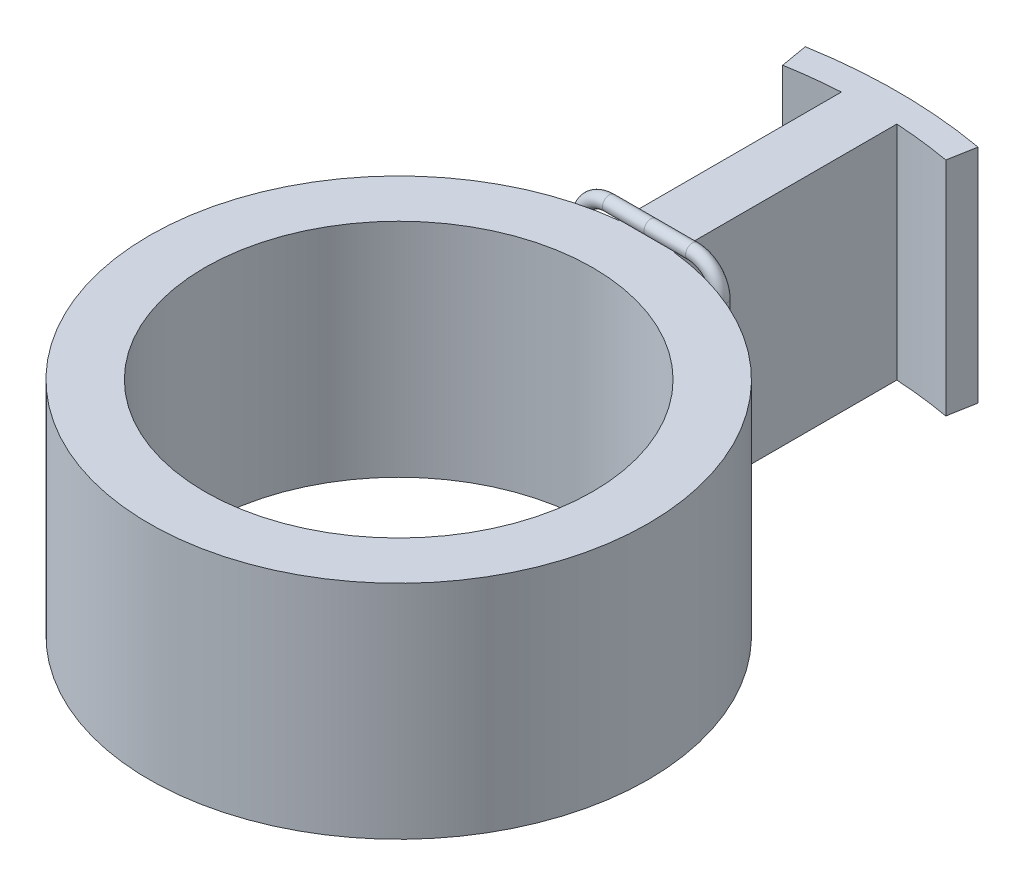
ISO-10303-21;
HEADER;
FILE_DESCRIPTION(('STEP AP214'),'2;1');
FILE_NAME('part.step','',(''),(''),'','','');
FILE_SCHEMA(('AUTOMOTIVE_DESIGN { 1 0 10303 214 1 1 1 1 }'));
ENDSEC;
DATA;
#1=APPLICATION_CONTEXT('core data for automotive mechanical design processes');
#2=APPLICATION_PROTOCOL_DEFINITION('international standard','automotive_design',2000,#1);
#3=PRODUCT_CONTEXT('',#1,'mechanical');
#4=PRODUCT('Part','Part','',(#3));
#5=PRODUCT_RELATED_PRODUCT_CATEGORY('part','',(#4));
#6=PRODUCT_DEFINITION_FORMATION('','',#4);
#7=PRODUCT_DEFINITION_CONTEXT('part definition',#1,'design');
#8=PRODUCT_DEFINITION('design','',#6,#7);
#9=PRODUCT_DEFINITION_SHAPE('','',#8);
#10=(LENGTH_UNIT() NAMED_UNIT(*) SI_UNIT(.MILLI.,.METRE.));
#11=(NAMED_UNIT(*) PLANE_ANGLE_UNIT() SI_UNIT($,.RADIAN.));
#12=(NAMED_UNIT(*) SI_UNIT($,.STERADIAN.) SOLID_ANGLE_UNIT());
#13=UNCERTAINTY_MEASURE_WITH_UNIT(LENGTH_MEASURE(1.E-05),#10,'distance_accuracy_value','');
#14=(GEOMETRIC_REPRESENTATION_CONTEXT(3) GLOBAL_UNCERTAINTY_ASSIGNED_CONTEXT((#13)) GLOBAL_UNIT_ASSIGNED_CONTEXT((#10,
#11,#12)) REPRESENTATION_CONTEXT('',''));
#15=CARTESIAN_POINT('',(0.,0.,0.));
#16=DIRECTION('',(0.,0.,1.));
#17=DIRECTION('',(1.,0.,0.));
#18=AXIS2_PLACEMENT_3D('',#15,#16,#17);
#19=CARTESIAN_POINT('',(0.,80.,0.));
#20=DIRECTION('',(0.,1.,0.));
#21=DIRECTION('',(0.,0.,1.));
#22=AXIS2_PLACEMENT_3D('',#19,#20,#21);
#23=PLANE('',#22);
#24=DIRECTION('',(1.,0.,0.));
#25=VECTOR('',#24,1.);
#26=CARTESIAN_POINT('',(-14.9999999999999,80.,-89.9102752641149));
#27=LINE('',#26,#25);
#28=CARTESIAN_POINT('',(-9.99999999999999,80.,-89.9102752641149));
#29=VERTEX_POINT('',#28);
#30=CARTESIAN_POINT('',(0.,80.,-89.9102752641149));
#31=VERTEX_POINT('',#30);
#32=EDGE_CURVE('E242',#29,#31,#27,.T.);
#33=ORIENTED_EDGE('',*,*,#32,.F.);
#34=DIRECTION('',(0.,0.,1.));
#35=VECTOR('',#34,1.);
#36=CARTESIAN_POINT('',(-9.99999999999998,80.,0.));
#37=LINE('',#36,#35);
#38=CARTESIAN_POINT('',(-9.99999999999999,80.,-89.4427190999916));
#39=VERTEX_POINT('',#38);
#40=EDGE_CURVE('E195',#29,#39,#37,.T.);
#41=ORIENTED_EDGE('',*,*,#40,.T.);
#42=CARTESIAN_POINT('',(0.,80.,0.));
#43=DIRECTION('',(0.,1.,0.));
#44=DIRECTION('',(0.,0.,1.));
#45=AXIS2_PLACEMENT_3D('',#42,#43,#44);
#46=CIRCLE('',#45,90.);
#47=CARTESIAN_POINT('',(9.99999999999999,80.,-89.4427190999916));
#48=VERTEX_POINT('',#47);
#49=EDGE_CURVE('E136',#39,#48,#46,.T.);
#50=ORIENTED_EDGE('',*,*,#49,.T.);
#51=DIRECTION('',(0.,0.,1.));
#52=VECTOR('',#51,1.);
#53=CARTESIAN_POINT('',(9.99999999999998,80.,0.));
#54=LINE('',#53,#52);
#55=CARTESIAN_POINT('',(9.99999999999999,80.,-89.9102752641149));
#56=VERTEX_POINT('',#55);
#57=EDGE_CURVE('E155',#56,#48,#54,.T.);
#58=ORIENTED_EDGE('',*,*,#57,.F.);
#59=DIRECTION('',(1.,0.,0.));
#60=VECTOR('',#59,1.);
#61=CARTESIAN_POINT('',(0.,80.,-89.9102752641149));
#62=LINE('',#61,#60);
#63=EDGE_CURVE('E249',#31,#56,#62,.T.);
#64=ORIENTED_EDGE('',*,*,#63,.F.);
#65=EDGE_LOOP('',(#33,#41,#50,#58,#64));
#66=FACE_BOUND('',#65,.T.);
#67=CARTESIAN_POINT('',(0.,80.,0.));
#68=DIRECTION('',(0.,1.,0.));
#69=DIRECTION('',(0.,0.,1.));
#70=AXIS2_PLACEMENT_3D('',#67,#68,#69);
#71=CIRCLE('',#70,70.);
#72=CARTESIAN_POINT('',(0.,80.,70.));
#73=VERTEX_POINT('',#72);
#74=EDGE_CURVE('E184',#73,#73,#71,.T.);
#75=ORIENTED_EDGE('',*,*,#74,.F.);
#76=EDGE_LOOP('',(#75));
#77=FACE_BOUND('',#76,.T.);
#78=ADVANCED_FACE('F35',(#66,#77),#23,.T.);
#79=CARTESIAN_POINT('',(0.,0.,0.));
#80=DIRECTION('',(0.,1.,0.));
#81=DIRECTION('',(0.,0.,1.));
#82=AXIS2_PLACEMENT_3D('',#79,#80,#81);
#83=PLANE('',#82);
#84=DIRECTION('',(0.,0.,1.));
#85=VECTOR('',#84,1.);
#86=CARTESIAN_POINT('',(9.99999999999998,0.,0.));
#87=LINE('',#86,#85);
#88=CARTESIAN_POINT('',(10.,0.,-169.705627484771));
#89=VERTEX_POINT('',#88);
#90=CARTESIAN_POINT('',(9.99999999999999,0.,-92.0897247358852));
#91=VERTEX_POINT('',#90);
#92=EDGE_CURVE('E146',#89,#91,#87,.T.);
#93=ORIENTED_EDGE('',*,*,#92,.T.);
#94=DIRECTION('',(-1.,0.,0.));
#95=VECTOR('',#94,1.);
#96=CARTESIAN_POINT('',(14.9999999999999,0.,-92.0897247358852));
#97=LINE('',#96,#95);
#98=CARTESIAN_POINT('',(-9.99999999999999,0.,-92.0897247358852));
#99=VERTEX_POINT('',#98);
#100=EDGE_CURVE('E131',#91,#99,#97,.T.);
#101=ORIENTED_EDGE('',*,*,#100,.T.);
#102=DIRECTION('',(0.,0.,1.));
#103=VECTOR('',#102,1.);
#104=CARTESIAN_POINT('',(-9.99999999999998,0.,0.));
#105=LINE('',#104,#103);
#106=CARTESIAN_POINT('',(-10.,0.,-169.705627484771));
#107=VERTEX_POINT('',#106);
#108=EDGE_CURVE('E143',#107,#99,#105,.T.);
#109=ORIENTED_EDGE('',*,*,#108,.F.);
#110=CARTESIAN_POINT('',(0.,0.,0.));
#111=DIRECTION('',(0.,1.,0.));
#112=DIRECTION('',(0.,0.,1.));
#113=AXIS2_PLACEMENT_3D('',#110,#111,#112);
#114=CIRCLE('',#113,170.);
#115=CARTESIAN_POINT('',(-28.9705451889221,0.,-167.513305475883));
#116=VERTEX_POINT('',#115);
#117=EDGE_CURVE('E160',#116,#107,#114,.F.);
#118=ORIENTED_EDGE('',*,*,#117,.F.);
#119=DIRECTION('',(0.170414971699541,0.,0.985372385152256));
#120=VECTOR('',#119,1.);
#121=CARTESIAN_POINT('',(-1.84609649783111E-13,0.,0.));
#122=LINE('',#121,#120);
#123=CARTESIAN_POINT('',(-30.6746949059173,0.,-177.367029327405));
#124=VERTEX_POINT('',#123);
#125=EDGE_CURVE('E216',#124,#116,#122,.T.);
#126=ORIENTED_EDGE('',*,*,#125,.F.);
#127=CARTESIAN_POINT('',(0.,0.,0.));
#128=DIRECTION('',(0.,1.,0.));
#129=DIRECTION('',(0.,0.,1.));
#130=AXIS2_PLACEMENT_3D('',#127,#128,#129);
#131=CIRCLE('',#130,179.999999999999);
#132=CARTESIAN_POINT('',(31.8383123438577,0.,-177.161852177874));
#133=VERTEX_POINT('',#132);
#134=EDGE_CURVE('E214',#124,#133,#131,.F.);
#135=ORIENTED_EDGE('',*,*,#134,.T.);
#136=DIRECTION('',(-0.176879513021431,0.,0.984232512099302));
#137=VECTOR('',#136,1.);
#138=CARTESIAN_POINT('',(1.36589699564663E-13,0.,0.));
#139=LINE('',#138,#137);
#140=CARTESIAN_POINT('',(30.0695172136434,0.,-167.319527056881));
#141=VERTEX_POINT('',#140);
#142=EDGE_CURVE('E211',#133,#141,#139,.T.);
#143=ORIENTED_EDGE('',*,*,#142,.T.);
#144=CARTESIAN_POINT('',(0.,0.,0.));
#145=DIRECTION('',(0.,1.,0.));
#146=DIRECTION('',(0.,0.,1.));
#147=AXIS2_PLACEMENT_3D('',#144,#145,#146);
#148=CIRCLE('',#147,170.);
#149=EDGE_CURVE('E207',#89,#141,#148,.F.);
#150=ORIENTED_EDGE('',*,*,#149,.F.);
#151=EDGE_LOOP('',(#93,#101,#109,#118,#126,#135,#143,#150));
#152=FACE_BOUND('',#151,.T.);
#153=ADVANCED_FACE('F141',(#152),#83,.F.);
#154=CARTESIAN_POINT('',(0.,80.,0.));
#155=DIRECTION('',(0.,-1.,0.));
#156=DIRECTION('',(0.,0.,-1.));
#157=AXIS2_PLACEMENT_3D('',#154,#155,#156);
#158=CYLINDRICAL_SURFACE('',#157,70.);
#159=ORIENTED_EDGE('',*,*,#74,.T.);
#160=EDGE_LOOP('',(#159));
#161=FACE_BOUND('',#160,.T.);
#162=CARTESIAN_POINT('',(0.,0.,0.));
#163=DIRECTION('',(0.,1.,0.));
#164=DIRECTION('',(0.,0.,1.));
#165=AXIS2_PLACEMENT_3D('',#162,#163,#164);
#166=CIRCLE('',#165,70.);
#167=CARTESIAN_POINT('',(0.,0.,70.));
#168=VERTEX_POINT('',#167);
#169=EDGE_CURVE('E183',#168,#168,#166,.T.);
#170=ORIENTED_EDGE('',*,*,#169,.F.);
#171=EDGE_LOOP('',(#170));
#172=FACE_BOUND('',#171,.T.);
#173=ADVANCED_FACE('F37',(#161,#172),#158,.F.);
#174=CARTESIAN_POINT('',(0.,80.,0.));
#175=DIRECTION('',(0.,-1.,0.));
#176=DIRECTION('',(0.,0.,-1.));
#177=AXIS2_PLACEMENT_3D('',#174,#175,#176);
#178=CYLINDRICAL_SURFACE('',#177,90.);
#179=CARTESIAN_POINT('',(0.,0.,0.));
#180=DIRECTION('',(0.,1.,0.));
#181=DIRECTION('',(0.,0.,1.));
#182=AXIS2_PLACEMENT_3D('',#179,#180,#181);
#183=CIRCLE('',#182,90.);
#184=CARTESIAN_POINT('',(-9.99999999999999,0.,-89.4427190999916));
#185=VERTEX_POINT('',#184);
#186=CARTESIAN_POINT('',(9.99999999999999,0.,-89.4427190999916));
#187=VERTEX_POINT('',#186);
#188=EDGE_CURVE('E187',#185,#187,#183,.T.);
#189=ORIENTED_EDGE('',*,*,#188,.T.);
#190=DIRECTION('',(0.,-1.,0.));
#191=VECTOR('',#190,1.);
#192=CARTESIAN_POINT('',(9.99999999999999,80.,-89.4427190999916));
#193=LINE('',#192,#191);
#194=EDGE_CURVE('E164',#48,#187,#193,.T.);
#195=ORIENTED_EDGE('',*,*,#194,.F.);
#196=ORIENTED_EDGE('',*,*,#49,.F.);
#197=DIRECTION('',(0.,-1.,0.));
#198=VECTOR('',#197,1.);
#199=CARTESIAN_POINT('',(-9.99999999999999,80.,-89.4427190999916));
#200=LINE('',#199,#198);
#201=EDGE_CURVE('E167',#39,#185,#200,.T.);
#202=ORIENTED_EDGE('',*,*,#201,.T.);
#203=EDGE_LOOP('',(#189,#195,#196,#202));
#204=FACE_BOUND('',#203,.T.);
#205=ADVANCED_FACE('F276',(#204),#178,.T.);
#206=DIRECTION('',(1.,0.,0.));
#207=VECTOR('',#206,1.);
#208=CARTESIAN_POINT('',(-14.9999999999999,80.,-92.0897247358851));
#209=LINE('',#208,#207);
#210=CARTESIAN_POINT('',(0.,80.,-92.0897247358851));
#211=VERTEX_POINT('',#210);
#212=CARTESIAN_POINT('',(-9.99999999999999,80.,-92.0897247358851));
#213=VERTEX_POINT('',#212);
#214=EDGE_CURVE('E50',#211,#213,#209,.F.);
#215=ORIENTED_EDGE('',*,*,#214,.F.);
#216=DIRECTION('',(1.,0.,0.));
#217=VECTOR('',#216,1.);
#218=CARTESIAN_POINT('',(0.,80.,-92.0897247358851));
#219=LINE('',#218,#217);
#220=CARTESIAN_POINT('',(9.99999999999999,80.,-92.0897247358851));
#221=VERTEX_POINT('',#220);
#222=EDGE_CURVE('E247',#221,#211,#219,.F.);
#223=ORIENTED_EDGE('',*,*,#222,.F.);
#224=CARTESIAN_POINT('',(10.,80.,-169.705627484771));
#225=VERTEX_POINT('',#224);
#226=EDGE_CURVE('E158',#225,#221,#54,.T.);
#227=ORIENTED_EDGE('',*,*,#226,.F.);
#228=CARTESIAN_POINT('',(0.,80.,0.));
#229=DIRECTION('',(0.,1.,0.));
#230=DIRECTION('',(0.,0.,1.));
#231=AXIS2_PLACEMENT_3D('',#228,#229,#230);
#232=CIRCLE('',#231,170.);
#233=CARTESIAN_POINT('',(30.0695172136434,80.,-167.319527056881));
#234=VERTEX_POINT('',#233);
#235=EDGE_CURVE('E251',#225,#234,#232,.F.);
#236=ORIENTED_EDGE('',*,*,#235,.T.);
#237=DIRECTION('',(-0.176879513021431,0.,0.984232512099302));
#238=VECTOR('',#237,1.);
#239=CARTESIAN_POINT('',(1.36589699564663E-13,80.,0.));
#240=LINE('',#239,#238);
#241=CARTESIAN_POINT('',(31.8383123438577,80.,-177.161852177874));
#242=VERTEX_POINT('',#241);
#243=EDGE_CURVE('E253',#242,#234,#240,.T.);
#244=ORIENTED_EDGE('',*,*,#243,.F.);
#245=CARTESIAN_POINT('',(0.,80.,0.));
#246=DIRECTION('',(0.,1.,0.));
#247=DIRECTION('',(0.,0.,1.));
#248=AXIS2_PLACEMENT_3D('',#245,#246,#247);
#249=CIRCLE('',#248,179.999999999999);
#250=CARTESIAN_POINT('',(-30.6746949059173,80.,-177.367029327405));
#251=VERTEX_POINT('',#250);
#252=EDGE_CURVE('E229',#251,#242,#249,.F.);
#253=ORIENTED_EDGE('',*,*,#252,.F.);
#254=DIRECTION('',(0.170414971699541,0.,0.985372385152256));
#255=VECTOR('',#254,1.);
#256=CARTESIAN_POINT('',(-1.84609649783111E-13,80.,0.));
#257=LINE('',#256,#255);
#258=CARTESIAN_POINT('',(-28.9705451889221,80.,-167.513305475883));
#259=VERTEX_POINT('',#258);
#260=EDGE_CURVE('E255',#251,#259,#257,.T.);
#261=ORIENTED_EDGE('',*,*,#260,.T.);
#262=CARTESIAN_POINT('',(0.,80.,0.));
#263=DIRECTION('',(0.,1.,0.));
#264=DIRECTION('',(0.,0.,1.));
#265=AXIS2_PLACEMENT_3D('',#262,#263,#264);
#266=CIRCLE('',#265,170.);
#267=CARTESIAN_POINT('',(-10.,80.,-169.705627484771));
#268=VERTEX_POINT('',#267);
#269=EDGE_CURVE('E201',#259,#268,#266,.F.);
#270=ORIENTED_EDGE('',*,*,#269,.T.);
#271=EDGE_CURVE('E168',#268,#213,#37,.T.);
#272=ORIENTED_EDGE('',*,*,#271,.T.);
#273=EDGE_LOOP('',(#215,#223,#227,#236,#244,#253,#261,#270,#272));
#274=FACE_BOUND('',#273,.T.);
#275=ADVANCED_FACE('F198',(#274),#23,.T.);
#276=ORIENTED_EDGE('',*,*,#169,.T.);
#277=EDGE_LOOP('',(#276));
#278=FACE_BOUND('',#277,.T.);
#279=CARTESIAN_POINT('',(-9.99999999999999,0.,-89.9102752641148));
#280=VERTEX_POINT('',#279);
#281=EDGE_CURVE('E156',#280,#185,#105,.T.);
#282=ORIENTED_EDGE('',*,*,#281,.F.);
#283=DIRECTION('',(-1.,0.,0.));
#284=VECTOR('',#283,1.);
#285=CARTESIAN_POINT('',(14.9999999999999,0.,-89.9102752641148));
#286=LINE('',#285,#284);
#287=CARTESIAN_POINT('',(9.99999999999999,0.,-89.9102752641148));
#288=VERTEX_POINT('',#287);
#289=EDGE_CURVE('E58',#280,#288,#286,.F.);
#290=ORIENTED_EDGE('',*,*,#289,.T.);
#291=EDGE_CURVE('E208',#288,#187,#87,.T.);
#292=ORIENTED_EDGE('',*,*,#291,.T.);
#293=ORIENTED_EDGE('',*,*,#188,.F.);
#294=EDGE_LOOP('',(#282,#290,#292,#293));
#295=FACE_BOUND('',#294,.T.);
#296=ADVANCED_FACE('F272',(#278,#295),#83,.F.);
#297=CARTESIAN_POINT('',(9.99999999999998,80.,0.));
#298=DIRECTION('',(1.,0.,0.));
#299=DIRECTION('',(0.,0.,-1.));
#300=AXIS2_PLACEMENT_3D('',#297,#298,#299);
#301=PLANE('',#300);
#302=CARTESIAN_POINT('',(9.99999999999999,-2.24999999999998,-91.));
#303=DIRECTION('',(1.,0.,0.));
#304=DIRECTION('',(0.,0.,-1.));
#305=AXIS2_PLACEMENT_3D('',#302,#303,#304);
#306=CIRCLE('',#305,2.5);
#307=EDGE_CURVE('E147',#91,#288,#306,.T.);
#308=ORIENTED_EDGE('',*,*,#307,.F.);
#309=ORIENTED_EDGE('',*,*,#92,.F.);
#310=DIRECTION('',(0.,-1.,0.));
#311=VECTOR('',#310,1.);
#312=CARTESIAN_POINT('',(10.,80.,-169.705627484771));
#313=LINE('',#312,#311);
#314=EDGE_CURVE('E181',#225,#89,#313,.T.);
#315=ORIENTED_EDGE('',*,*,#314,.F.);
#316=ORIENTED_EDGE('',*,*,#226,.T.);
#317=CARTESIAN_POINT('',(9.99999999999999,82.25,-91.));
#318=DIRECTION('',(1.,0.,0.));
#319=DIRECTION('',(0.,0.,-1.));
#320=AXIS2_PLACEMENT_3D('',#317,#318,#319);
#321=CIRCLE('',#320,2.5);
#322=EDGE_CURVE('E11',#56,#221,#321,.T.);
#323=ORIENTED_EDGE('',*,*,#322,.F.);
#324=ORIENTED_EDGE('',*,*,#57,.T.);
#325=ORIENTED_EDGE('',*,*,#194,.T.);
#326=ORIENTED_EDGE('',*,*,#291,.F.);
#327=EDGE_LOOP('',(#308,#309,#315,#316,#323,#324,#325,#326));
#328=FACE_BOUND('',#327,.T.);
#329=ADVANCED_FACE('F237',(#328),#301,.T.);
#330=CARTESIAN_POINT('',(0.,80.,0.));
#331=DIRECTION('',(0.,-1.,0.));
#332=DIRECTION('',(0.,0.,-1.));
#333=AXIS2_PLACEMENT_3D('',#330,#331,#332);
#334=CYLINDRICAL_SURFACE('',#333,170.);
#335=ORIENTED_EDGE('',*,*,#149,.T.);
#336=DIRECTION('',(0.,-1.,0.));
#337=VECTOR('',#336,1.);
#338=CARTESIAN_POINT('',(30.0695172136434,80.,-167.319527056881));
#339=LINE('',#338,#337);
#340=EDGE_CURVE('E179',#234,#141,#339,.T.);
#341=ORIENTED_EDGE('',*,*,#340,.F.);
#342=ORIENTED_EDGE('',*,*,#235,.F.);
#343=ORIENTED_EDGE('',*,*,#314,.T.);
#344=EDGE_LOOP('',(#335,#341,#342,#343));
#345=FACE_BOUND('',#344,.T.);
#346=ADVANCED_FACE('F465',(#345),#334,.F.);
#347=CARTESIAN_POINT('',(1.36589699564663E-13,80.,0.));
#348=DIRECTION('',(0.984232512099302,0.,0.176879513021431));
#349=DIRECTION('',(0.176879513021431,0.,-0.984232512099302));
#350=AXIS2_PLACEMENT_3D('',#347,#348,#349);
#351=PLANE('',#350);
#352=ORIENTED_EDGE('',*,*,#142,.F.);
#353=DIRECTION('',(0.,-1.,0.));
#354=VECTOR('',#353,1.);
#355=CARTESIAN_POINT('',(31.8383123438577,80.,-177.161852177874));
#356=LINE('',#355,#354);
#357=EDGE_CURVE('E177',#242,#133,#356,.T.);
#358=ORIENTED_EDGE('',*,*,#357,.F.);
#359=ORIENTED_EDGE('',*,*,#243,.T.);
#360=ORIENTED_EDGE('',*,*,#340,.T.);
#361=EDGE_LOOP('',(#352,#358,#359,#360));
#362=FACE_BOUND('',#361,.T.);
#363=ADVANCED_FACE('F233',(#362),#351,.T.);
#364=CARTESIAN_POINT('',(0.,80.,0.));
#365=DIRECTION('',(0.,-1.,0.));
#366=DIRECTION('',(0.,0.,-1.));
#367=AXIS2_PLACEMENT_3D('',#364,#365,#366);
#368=CYLINDRICAL_SURFACE('',#367,179.999999999999);
#369=ORIENTED_EDGE('',*,*,#134,.F.);
#370=DIRECTION('',(0.,-1.,0.));
#371=VECTOR('',#370,1.);
#372=CARTESIAN_POINT('',(-30.6746949059173,80.,-177.367029327405));
#373=LINE('',#372,#371);
#374=EDGE_CURVE('E175',#251,#124,#373,.T.);
#375=ORIENTED_EDGE('',*,*,#374,.F.);
#376=ORIENTED_EDGE('',*,*,#252,.T.);
#377=ORIENTED_EDGE('',*,*,#357,.T.);
#378=EDGE_LOOP('',(#369,#375,#376,#377));
#379=FACE_BOUND('',#378,.T.);
#380=ADVANCED_FACE('F224',(#379),#368,.T.);
#381=CARTESIAN_POINT('',(-1.84609649783111E-13,80.,0.));
#382=DIRECTION('',(0.985372385152255,0.,-0.170414971699541));
#383=DIRECTION('',(-0.170414971699541,0.,-0.985372385152255));
#384=AXIS2_PLACEMENT_3D('',#381,#382,#383);
#385=PLANE('',#384);
#386=ORIENTED_EDGE('',*,*,#125,.T.);
#387=DIRECTION('',(0.,-1.,0.));
#388=VECTOR('',#387,1.);
#389=CARTESIAN_POINT('',(-28.9705451889221,80.,-167.513305475883));
#390=LINE('',#389,#388);
#391=EDGE_CURVE('E172',#259,#116,#390,.T.);
#392=ORIENTED_EDGE('',*,*,#391,.F.);
#393=ORIENTED_EDGE('',*,*,#260,.F.);
#394=ORIENTED_EDGE('',*,*,#374,.T.);
#395=EDGE_LOOP('',(#386,#392,#393,#394));
#396=FACE_BOUND('',#395,.T.);
#397=ADVANCED_FACE('F256',(#396),#385,.F.);
#398=CARTESIAN_POINT('',(0.,80.,0.));
#399=DIRECTION('',(0.,-1.,0.));
#400=DIRECTION('',(0.,0.,-1.));
#401=AXIS2_PLACEMENT_3D('',#398,#399,#400);
#402=CYLINDRICAL_SURFACE('',#401,170.);
#403=ORIENTED_EDGE('',*,*,#117,.T.);
#404=DIRECTION('',(0.,-1.,0.));
#405=VECTOR('',#404,1.);
#406=CARTESIAN_POINT('',(-10.,80.,-169.705627484771));
#407=LINE('',#406,#405);
#408=EDGE_CURVE('E154',#268,#107,#407,.T.);
#409=ORIENTED_EDGE('',*,*,#408,.F.);
#410=ORIENTED_EDGE('',*,*,#269,.F.);
#411=ORIENTED_EDGE('',*,*,#391,.T.);
#412=EDGE_LOOP('',(#403,#409,#410,#411));
#413=FACE_BOUND('',#412,.T.);
#414=ADVANCED_FACE('F221',(#413),#402,.F.);
#415=CARTESIAN_POINT('',(-9.99999999999998,80.,0.));
#416=DIRECTION('',(1.,0.,0.));
#417=DIRECTION('',(0.,0.,-1.));
#418=AXIS2_PLACEMENT_3D('',#415,#416,#417);
#419=PLANE('',#418);
#420=ORIENTED_EDGE('',*,*,#40,.F.);
#421=CARTESIAN_POINT('',(-9.99999999999999,82.25,-91.));
#422=DIRECTION('',(1.,0.,0.));
#423=DIRECTION('',(0.,0.,-1.));
#424=AXIS2_PLACEMENT_3D('',#421,#422,#423);
#425=CIRCLE('',#424,2.5);
#426=EDGE_CURVE('E43',#29,#213,#425,.T.);
#427=ORIENTED_EDGE('',*,*,#426,.T.);
#428=ORIENTED_EDGE('',*,*,#271,.F.);
#429=ORIENTED_EDGE('',*,*,#408,.T.);
#430=ORIENTED_EDGE('',*,*,#108,.T.);
#431=CARTESIAN_POINT('',(-9.99999999999999,-2.24999999999998,-91.));
#432=DIRECTION('',(1.,0.,0.));
#433=DIRECTION('',(0.,0.,-1.));
#434=AXIS2_PLACEMENT_3D('',#431,#432,#433);
#435=CIRCLE('',#434,2.5);
#436=EDGE_CURVE('E127',#99,#280,#435,.T.);
#437=ORIENTED_EDGE('',*,*,#436,.T.);
#438=ORIENTED_EDGE('',*,*,#281,.T.);
#439=ORIENTED_EDGE('',*,*,#201,.F.);
#440=EDGE_LOOP('',(#420,#427,#428,#429,#430,#437,#438,#439));
#441=FACE_BOUND('',#440,.T.);
#442=ADVANCED_FACE('F151',(#441),#419,.F.);
#443=CARTESIAN_POINT('',(-14.9999999999999,82.25,-91.));
#444=DIRECTION('',(1.,0.,0.));
#445=DIRECTION('',(0.,0.,-1.));
#446=AXIS2_PLACEMENT_3D('',#443,#444,#445);
#447=CYLINDRICAL_SURFACE('',#446,2.5);
#448=ORIENTED_EDGE('',*,*,#426,.F.);
#449=ORIENTED_EDGE('',*,*,#32,.T.);
#450=CARTESIAN_POINT('',(0.,82.25,-91.));
#451=DIRECTION('',(1.,0.,0.));
#452=DIRECTION('',(0.,0.,-1.));
#453=AXIS2_PLACEMENT_3D('',#450,#451,#452);
#454=CIRCLE('',#453,2.5);
#455=EDGE_CURVE('E319',#211,#31,#454,.T.);
#456=ORIENTED_EDGE('',*,*,#455,.F.);
#457=ORIENTED_EDGE('',*,*,#214,.T.);
#458=EDGE_LOOP('',(#448,#449,#456,#457));
#459=FACE_BOUND('',#458,.T.);
#460=CARTESIAN_POINT('',(-15.0000000000005,82.25,-91.));
#461=DIRECTION('',(1.,0.,0.));
#462=DIRECTION('',(0.,0.,-1.));
#463=AXIS2_PLACEMENT_3D('',#460,#461,#462);
#464=CIRCLE('',#463,2.5);
#465=CARTESIAN_POINT('',(-15.0000000000006,84.75,-91.));
#466=VERTEX_POINT('',#465);
#467=EDGE_CURVE('E294',#466,#466,#464,.T.);
#468=ORIENTED_EDGE('',*,*,#467,.T.);
#469=EDGE_LOOP('',(#468));
#470=FACE_BOUND('',#469,.T.);
#471=ADVANCED_FACE('F324',(#459,#470),#447,.T.);
#472=CARTESIAN_POINT('',(-15.,72.25,-91.));
#473=DIRECTION('',(0.,0.,-1.));
#474=DIRECTION('',(-1.,0.,0.));
#475=AXIS2_PLACEMENT_3D('',#472,#473,#474);
#476=TOROIDAL_SURFACE('',#475,10.,2.5);
#477=CARTESIAN_POINT('',(-25.,72.25,-91.));
#478=DIRECTION('',(0.,1.,0.));
#479=DIRECTION('',(0.,0.,-1.));
#480=AXIS2_PLACEMENT_3D('',#477,#478,#479);
#481=CIRCLE('',#480,2.5);
#482=CARTESIAN_POINT('',(-27.5,72.2499999999999,-91.));
#483=VERTEX_POINT('',#482);
#484=EDGE_CURVE('E296',#483,#483,#481,.T.);
#485=CARTESIAN_POINT('',(-15.,72.25,-91.));
#486=DIRECTION('',(0.,0.,-1.));
#487=DIRECTION('',(-1.,0.,0.));
#488=AXIS2_PLACEMENT_3D('',#485,#486,#487);
#489=CIRCLE('',#488,12.5);
#490=EDGE_CURVE('',#483,#466,#489,.T.);
#491=ORIENTED_EDGE('',*,*,#484,.T.);
#492=ORIENTED_EDGE('',*,*,#467,.F.);
#493=ORIENTED_EDGE('',*,*,#490,.T.);
#494=ORIENTED_EDGE('',*,*,#490,.F.);
#495=EDGE_LOOP('',(#491,#493,#492,#494));
#496=FACE_BOUND('',#495,.T.);
#497=ADVANCED_FACE('F327',(#496),#476,.T.);
#498=CARTESIAN_POINT('',(-25.,7.7500000000001,-91.));
#499=DIRECTION('',(0.,1.,0.));
#500=DIRECTION('',(0.,0.,1.));
#501=AXIS2_PLACEMENT_3D('',#498,#499,#500);
#502=CYLINDRICAL_SURFACE('',#501,2.5);
#503=ORIENTED_EDGE('',*,*,#484,.F.);
#504=EDGE_LOOP('',(#503));
#505=FACE_BOUND('',#504,.T.);
#506=CARTESIAN_POINT('',(-25.,7.75000000000003,-91.));
#507=DIRECTION('',(0.,1.,0.));
#508=DIRECTION('',(0.,0.,-1.));
#509=AXIS2_PLACEMENT_3D('',#506,#507,#508);
#510=CIRCLE('',#509,2.5);
#511=CARTESIAN_POINT('',(-27.5,7.75000000000003,-91.));
#512=VERTEX_POINT('',#511);
#513=EDGE_CURVE('E301',#512,#512,#510,.T.);
#514=ORIENTED_EDGE('',*,*,#513,.T.);
#515=EDGE_LOOP('',(#514));
#516=FACE_BOUND('',#515,.T.);
#517=ADVANCED_FACE('F333',(#505,#516),#502,.T.);
#518=CARTESIAN_POINT('',(-15.,7.75000000000003,-91.));
#519=DIRECTION('',(0.,0.,-1.));
#520=DIRECTION('',(-1.,0.,0.));
#521=AXIS2_PLACEMENT_3D('',#518,#519,#520);
#522=TOROIDAL_SURFACE('',#521,10.,2.5);
#523=CARTESIAN_POINT('',(-14.9999999999999,-2.24999999999997,-91.));
#524=DIRECTION('',(-1.,0.,0.));
#525=DIRECTION('',(0.,0.,-1.));
#526=AXIS2_PLACEMENT_3D('',#523,#524,#525);
#527=CIRCLE('',#526,2.5);
#528=CARTESIAN_POINT('',(-14.9999999999999,-4.74999999999997,-91.));
#529=VERTEX_POINT('',#528);
#530=EDGE_CURVE('E304',#529,#529,#527,.T.);
#531=CARTESIAN_POINT('',(-15.,7.75000000000003,-91.));
#532=DIRECTION('',(0.,0.,-1.));
#533=DIRECTION('',(-1.,0.,0.));
#534=AXIS2_PLACEMENT_3D('',#531,#532,#533);
#535=CIRCLE('',#534,12.5);
#536=EDGE_CURVE('',#529,#512,#535,.T.);
#537=ORIENTED_EDGE('',*,*,#530,.T.);
#538=ORIENTED_EDGE('',*,*,#513,.F.);
#539=ORIENTED_EDGE('',*,*,#536,.T.);
#540=ORIENTED_EDGE('',*,*,#536,.F.);
#541=EDGE_LOOP('',(#537,#539,#538,#540));
#542=FACE_BOUND('',#541,.T.);
#543=ADVANCED_FACE('F339',(#542),#522,.T.);
#544=CARTESIAN_POINT('',(14.9999999999999,-2.24999999999997,-91.));
#545=DIRECTION('',(-1.,0.,0.));
#546=DIRECTION('',(0.,-1.,0.));
#547=AXIS2_PLACEMENT_3D('',#544,#545,#546);
#548=CYLINDRICAL_SURFACE('',#547,2.5);
#549=ORIENTED_EDGE('',*,*,#100,.F.);
#550=ORIENTED_EDGE('',*,*,#307,.T.);
#551=ORIENTED_EDGE('',*,*,#289,.F.);
#552=ORIENTED_EDGE('',*,*,#436,.F.);
#553=EDGE_LOOP('',(#549,#550,#551,#552));
#554=FACE_BOUND('',#553,.T.);
#555=ORIENTED_EDGE('',*,*,#530,.F.);
#556=EDGE_LOOP('',(#555));
#557=FACE_BOUND('',#556,.T.);
#558=CARTESIAN_POINT('',(14.9999999999999,-2.24999999999997,-91.));
#559=DIRECTION('',(-1.,0.,0.));
#560=DIRECTION('',(0.,0.,-1.));
#561=AXIS2_PLACEMENT_3D('',#558,#559,#560);
#562=CIRCLE('',#561,2.5);
#563=CARTESIAN_POINT('',(14.9999999999999,-4.74999999999996,-91.));
#564=VERTEX_POINT('',#563);
#565=EDGE_CURVE('E307',#564,#564,#562,.T.);
#566=ORIENTED_EDGE('',*,*,#565,.T.);
#567=EDGE_LOOP('',(#566));
#568=FACE_BOUND('',#567,.T.);
#569=ADVANCED_FACE('F129',(#554,#557,#568),#548,.T.);
#570=CARTESIAN_POINT('',(15.,7.75000000000003,-91.));
#571=DIRECTION('',(0.,0.,-1.));
#572=DIRECTION('',(-1.,0.,0.));
#573=AXIS2_PLACEMENT_3D('',#570,#571,#572);
#574=TOROIDAL_SURFACE('',#573,10.,2.5);
#575=CARTESIAN_POINT('',(25.,7.75000000000003,-91.));
#576=DIRECTION('',(0.,-1.,0.));
#577=DIRECTION('',(0.,0.,-1.));
#578=AXIS2_PLACEMENT_3D('',#575,#576,#577);
#579=CIRCLE('',#578,2.5);
#580=CARTESIAN_POINT('',(27.5,7.75000000000003,-91.));
#581=VERTEX_POINT('',#580);
#582=EDGE_CURVE('E310',#581,#581,#579,.T.);
#583=CARTESIAN_POINT('',(15.,7.75000000000003,-91.));
#584=DIRECTION('',(0.,0.,-1.));
#585=DIRECTION('',(-1.,0.,0.));
#586=AXIS2_PLACEMENT_3D('',#583,#584,#585);
#587=CIRCLE('',#586,12.5);
#588=EDGE_CURVE('',#581,#564,#587,.T.);
#589=ORIENTED_EDGE('',*,*,#582,.T.);
#590=ORIENTED_EDGE('',*,*,#565,.F.);
#591=ORIENTED_EDGE('',*,*,#588,.T.);
#592=ORIENTED_EDGE('',*,*,#588,.F.);
#593=EDGE_LOOP('',(#589,#591,#590,#592));
#594=FACE_BOUND('',#593,.T.);
#595=ADVANCED_FACE('F349',(#594),#574,.T.);
#596=CARTESIAN_POINT('',(25.,72.25,-91.));
#597=DIRECTION('',(0.,-1.,0.));
#598=DIRECTION('',(0.,0.,-1.));
#599=AXIS2_PLACEMENT_3D('',#596,#597,#598);
#600=CYLINDRICAL_SURFACE('',#599,2.5);
#601=ORIENTED_EDGE('',*,*,#582,.F.);
#602=EDGE_LOOP('',(#601));
#603=FACE_BOUND('',#602,.T.);
#604=CARTESIAN_POINT('',(25.,72.25,-91.));
#605=DIRECTION('',(0.,-1.,0.));
#606=DIRECTION('',(0.,0.,-1.));
#607=AXIS2_PLACEMENT_3D('',#604,#605,#606);
#608=CIRCLE('',#607,2.5);
#609=CARTESIAN_POINT('',(27.5,72.25,-91.));
#610=VERTEX_POINT('',#609);
#611=EDGE_CURVE('E313',#610,#610,#608,.T.);
#612=ORIENTED_EDGE('',*,*,#611,.T.);
#613=EDGE_LOOP('',(#612));
#614=FACE_BOUND('',#613,.T.);
#615=ADVANCED_FACE('F355',(#603,#614),#600,.T.);
#616=CARTESIAN_POINT('',(15.,72.25,-91.));
#617=DIRECTION('',(0.,0.,-1.));
#618=DIRECTION('',(-1.,0.,0.));
#619=AXIS2_PLACEMENT_3D('',#616,#617,#618);
#620=TOROIDAL_SURFACE('',#619,9.99999999999999,2.5);
#621=CARTESIAN_POINT('',(14.9999999999999,82.25,-91.));
#622=DIRECTION('',(1.,0.,0.));
#623=DIRECTION('',(0.,0.,-1.));
#624=AXIS2_PLACEMENT_3D('',#621,#622,#623);
#625=CIRCLE('',#624,2.5);
#626=CARTESIAN_POINT('',(14.9999999999999,84.75,-91.));
#627=VERTEX_POINT('',#626);
#628=EDGE_CURVE('E316',#627,#627,#625,.T.);
#629=CARTESIAN_POINT('',(15.,72.25,-91.));
#630=DIRECTION('',(0.,0.,-1.));
#631=DIRECTION('',(-1.,0.,0.));
#632=AXIS2_PLACEMENT_3D('',#629,#630,#631);
#633=CIRCLE('',#632,12.5);
#634=EDGE_CURVE('',#627,#610,#633,.T.);
#635=ORIENTED_EDGE('',*,*,#628,.T.);
#636=ORIENTED_EDGE('',*,*,#611,.F.);
#637=ORIENTED_EDGE('',*,*,#634,.T.);
#638=ORIENTED_EDGE('',*,*,#634,.F.);
#639=EDGE_LOOP('',(#635,#637,#636,#638));
#640=FACE_BOUND('',#639,.T.);
#641=ADVANCED_FACE('F361',(#640),#620,.T.);
#642=CARTESIAN_POINT('',(0.,82.25,-91.));
#643=DIRECTION('',(1.,0.,0.));
#644=DIRECTION('',(0.,0.,-1.));
#645=AXIS2_PLACEMENT_3D('',#642,#643,#644);
#646=CYLINDRICAL_SURFACE('',#645,2.5);
#647=ORIENTED_EDGE('',*,*,#455,.T.);
#648=ORIENTED_EDGE('',*,*,#63,.T.);
#649=ORIENTED_EDGE('',*,*,#322,.T.);
#650=ORIENTED_EDGE('',*,*,#222,.T.);
#651=EDGE_LOOP('',(#647,#648,#649,#650));
#652=FACE_BOUND('',#651,.T.);
#653=ORIENTED_EDGE('',*,*,#628,.F.);
#654=EDGE_LOOP('',(#653));
#655=FACE_BOUND('',#654,.T.);
#656=ADVANCED_FACE('F322',(#652,#655),#646,.T.);
#657=CLOSED_SHELL('',(#78,#153,#173,#205,#275,#296,#329,#346,#363,#380,#397,#414,#442,#471,#497,
#517,#543,#569,#595,#615,#641,#656));
#658=MANIFOLD_SOLID_BREP('B2',#657);
#659=ADVANCED_BREP_SHAPE_REPRESENTATION('',(#18,#658),#14);
#660=SHAPE_DEFINITION_REPRESENTATION(#9,#659);
ENDSEC;
END-ISO-10303-21;
